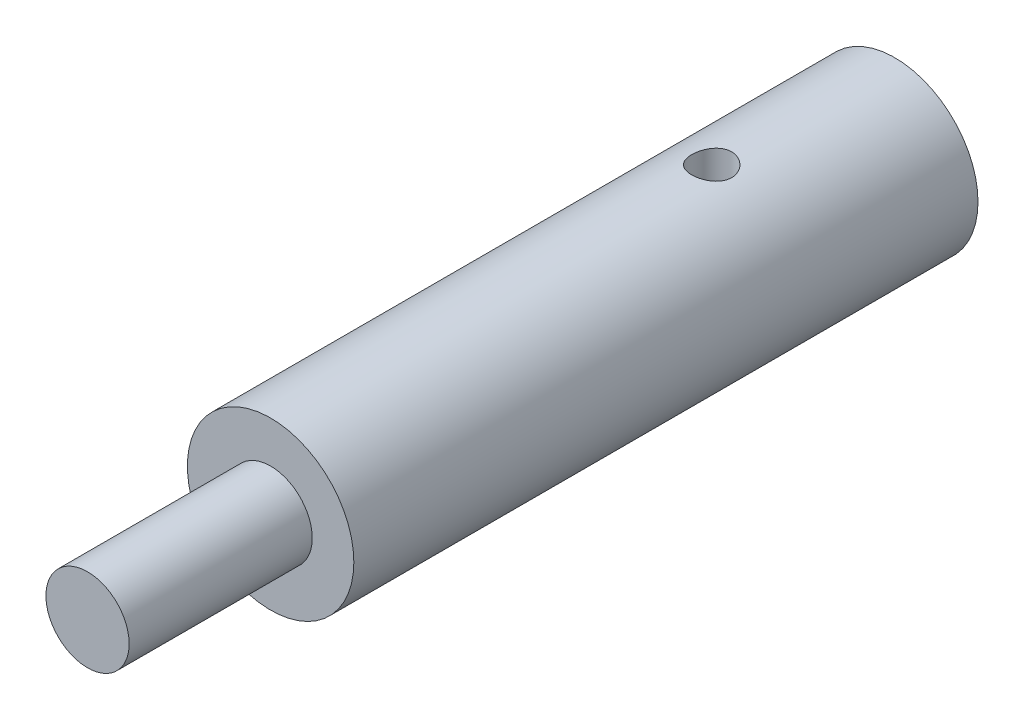
ISO-10303-21;
HEADER;
FILE_DESCRIPTION(('STEP AP214'),'2;1');
FILE_NAME('part.step','',(''),(''),'','','');
FILE_SCHEMA(('AUTOMOTIVE_DESIGN { 1 0 10303 214 1 1 1 1 }'));
ENDSEC;
DATA;
#1=APPLICATION_CONTEXT('core data for automotive mechanical design processes');
#2=APPLICATION_PROTOCOL_DEFINITION('international standard','automotive_design',2000,#1);
#3=PRODUCT_CONTEXT('',#1,'mechanical');
#4=PRODUCT('Part','Part','',(#3));
#5=PRODUCT_RELATED_PRODUCT_CATEGORY('part','',(#4));
#6=PRODUCT_DEFINITION_FORMATION('','',#4);
#7=PRODUCT_DEFINITION_CONTEXT('part definition',#1,'design');
#8=PRODUCT_DEFINITION('design','',#6,#7);
#9=PRODUCT_DEFINITION_SHAPE('','',#8);
#10=(LENGTH_UNIT() NAMED_UNIT(*) SI_UNIT(.MILLI.,.METRE.));
#11=(NAMED_UNIT(*) PLANE_ANGLE_UNIT() SI_UNIT($,.RADIAN.));
#12=(NAMED_UNIT(*) SI_UNIT($,.STERADIAN.) SOLID_ANGLE_UNIT());
#13=UNCERTAINTY_MEASURE_WITH_UNIT(LENGTH_MEASURE(1.E-05),#10,'distance_accuracy_value','');
#14=(GEOMETRIC_REPRESENTATION_CONTEXT(3) GLOBAL_UNCERTAINTY_ASSIGNED_CONTEXT((#13)) GLOBAL_UNIT_ASSIGNED_CONTEXT((#10,
#11,#12)) REPRESENTATION_CONTEXT('',''));
#15=CARTESIAN_POINT('',(0.,0.,0.));
#16=DIRECTION('',(0.,0.,1.));
#17=DIRECTION('',(1.,0.,0.));
#18=AXIS2_PLACEMENT_3D('',#15,#16,#17);
#19=CARTESIAN_POINT('',(0.,5.,0.));
#20=DIRECTION('',(0.,0.,-1.));
#21=DIRECTION('',(-1.,0.,0.));
#22=AXIS2_PLACEMENT_3D('',#19,#20,#21);
#23=PLANE('',#22);
#24=CARTESIAN_POINT('',(0.,0.,0.));
#25=DIRECTION('',(0.,0.,1.));
#26=DIRECTION('',(1.,0.,0.));
#27=AXIS2_PLACEMENT_3D('',#24,#25,#26);
#28=CIRCLE('',#27,5.);
#29=CARTESIAN_POINT('',(5.,0.,0.));
#30=VERTEX_POINT('',#29);
#31=EDGE_CURVE('E83',#30,#30,#28,.T.);
#32=ORIENTED_EDGE('',*,*,#31,.T.);
#33=EDGE_LOOP('',(#32));
#34=FACE_BOUND('',#33,.T.);
#35=ADVANCED_FACE('F31',(#34),#23,.F.);
#36=CARTESIAN_POINT('',(0.,0.,-97.));
#37=DIRECTION('',(0.,0.,1.));
#38=DIRECTION('',(1.,0.,0.));
#39=AXIS2_PLACEMENT_3D('',#36,#37,#38);
#40=PLANE('',#39);
#41=CARTESIAN_POINT('',(0.,0.,-97.));
#42=DIRECTION('',(0.,0.,1.));
#43=DIRECTION('',(1.,0.,0.));
#44=AXIS2_PLACEMENT_3D('',#41,#42,#43);
#45=CIRCLE('',#44,10.);
#46=CARTESIAN_POINT('',(10.,0.,-97.));
#47=VERTEX_POINT('',#46);
#48=EDGE_CURVE('E45',#47,#47,#45,.T.);
#49=ORIENTED_EDGE('',*,*,#48,.F.);
#50=EDGE_LOOP('',(#49));
#51=FACE_BOUND('',#50,.T.);
#52=ADVANCED_FACE('F72',(#51),#40,.F.);
#53=CARTESIAN_POINT('',(0.,0.,0.));
#54=DIRECTION('',(0.,0.,1.));
#55=DIRECTION('',(1.,0.,0.));
#56=AXIS2_PLACEMENT_3D('',#53,#54,#55);
#57=CYLINDRICAL_SURFACE('',#56,9.99999999999999);
#58=CARTESIAN_POINT('',(0.,-9.99999999999999,-72.6));
#59=CARTESIAN_POINT('',(0.132771143222972,-9.99999765719742,-72.6000040192618));
#60=CARTESIAN_POINT('',(0.265588336742452,-9.99732925078871,-72.6110547281888));
#61=CARTESIAN_POINT('',(0.527427432777102,-9.9869427157546,-72.6549061916763));
#62=CARTESIAN_POINT('',(0.656446946571418,-9.97922147697325,-72.6877203423957));
#63=CARTESIAN_POINT('',(0.90687071577121,-9.9595858566556,-72.7739938676035));
#64=CARTESIAN_POINT('',(1.02828353859857,-9.94767629622729,-72.8274295118861));
#65=CARTESIAN_POINT('',(1.2604201430381,-9.92093803540106,-72.9533483491567));
#66=CARTESIAN_POINT('',(1.37114377180133,-9.90610929326983,-73.0258318144618));
#67=CARTESIAN_POINT('',(1.58087410715178,-9.87483088118277,-73.1892513427004));
#68=CARTESIAN_POINT('',(1.67964761680384,-9.85835779634484,-73.2804822248394));
#69=CARTESIAN_POINT('',(1.86064864649554,-9.82580594961176,-73.4781750952517));
#70=CARTESIAN_POINT('',(1.94287443699591,-9.80972722908895,-73.5846386736328));
#71=CARTESIAN_POINT('',(2.08951994844012,-9.77955037524956,-73.8115566664139));
#72=CARTESIAN_POINT('',(2.15368301638052,-9.76548206522498,-73.9321812670071));
#73=CARTESIAN_POINT('',(2.26073266357866,-9.74125867299582,-74.1828958681028));
#74=CARTESIAN_POINT('',(2.30362235335651,-9.7311030187447,-74.3129844816185));
#75=CARTESIAN_POINT('',(2.3661204648693,-9.71609477400058,-74.5763812586151));
#76=CARTESIAN_POINT('',(2.38614609920493,-9.71114728274744,-74.7095848972204));
#77=CARTESIAN_POINT('',(2.40364647103269,-9.70683116847563,-74.9775459037142));
#78=CARTESIAN_POINT('',(2.40112457345919,-9.70746171300544,-75.1123030367655));
#79=CARTESIAN_POINT('',(2.37393529665554,-9.7141449109606,-75.3763807728103));
#80=CARTESIAN_POINT('',(2.34976082720396,-9.72007687370338,-75.5057556521516));
#81=CARTESIAN_POINT('',(2.28073713309751,-9.73650269910282,-75.7585578533183));
#82=CARTESIAN_POINT('',(2.23588653897622,-9.74699686393063,-75.8819847805875));
#83=CARTESIAN_POINT('',(2.12635296985426,-9.77147813875558,-76.1207303824675));
#84=CARTESIAN_POINT('',(2.06148758597569,-9.78549714606063,-76.2359619623333));
#85=CARTESIAN_POINT('',(1.91389351165106,-9.81543000369571,-76.454083600578));
#86=CARTESIAN_POINT('',(1.83116192274118,-9.83134416129098,-76.5569716522281));
#87=CARTESIAN_POINT('',(1.64761195127077,-9.8637856205912,-76.750314856255));
#88=CARTESIAN_POINT('',(1.54637651511927,-9.8803180630411,-76.8403736792498));
#89=CARTESIAN_POINT('',(1.33004473967753,-9.91175612759433,-77.0023077757971));
#90=CARTESIAN_POINT('',(1.21494803985713,-9.92666170736388,-77.0741825762341));
#91=CARTESIAN_POINT('',(0.973622781748649,-9.95323159655372,-77.1978377764902));
#92=CARTESIAN_POINT('',(0.847362229568439,-9.96488616464153,-77.2495579649902));
#93=CARTESIAN_POINT('',(0.587598084862946,-9.98356963793232,-77.3309320632389));
#94=CARTESIAN_POINT('',(0.454095770710135,-9.99059935669204,-77.3605898541014));
#95=CARTESIAN_POINT('',(0.187029919721337,-9.99912220341669,-77.3964016517216));
#96=CARTESIAN_POINT('',(0.0535427844360104,-10.0007425704603,-77.4030959139693));
#97=CARTESIAN_POINT('',(-0.212643505269299,-9.99862459355786,-77.3942665865193));
#98=CARTESIAN_POINT('',(-0.345342723811956,-9.99488669185398,-77.3787448304102));
#99=CARTESIAN_POINT('',(-0.604338064087074,-9.98255331161744,-77.3263704171869));
#100=CARTESIAN_POINT('',(-0.730696463449043,-9.97402412722935,-77.2898087123409));
#101=CARTESIAN_POINT('',(-0.975482640107798,-9.95306680125279,-77.1967214466438));
#102=CARTESIAN_POINT('',(-1.09390965331317,-9.94063828466544,-77.1401939656176));
#103=CARTESIAN_POINT('',(-1.32164920796458,-9.9129528119678,-77.0077067251217));
#104=CARTESIAN_POINT('',(-1.43077741392292,-9.89765225424743,-76.9314394264602));
#105=CARTESIAN_POINT('',(-1.63487923277297,-9.86599491255418,-76.7620344567896));
#106=CARTESIAN_POINT('',(-1.72985060059437,-9.84963796164085,-76.6688941151364));
#107=CARTESIAN_POINT('',(-1.90513963031985,-9.81725937143993,-76.4658873350321));
#108=CARTESIAN_POINT('',(-1.98507979238018,-9.80125354108243,-76.3556919023304));
#109=CARTESIAN_POINT('',(-2.12532816659143,-9.77180310372723,-76.1231276576865));
#110=CARTESIAN_POINT('',(-2.18563725778222,-9.75835838205941,-76.0007593911398));
#111=CARTESIAN_POINT('',(-2.28447194814786,-9.73569516180324,-75.7479899891556));
#112=CARTESIAN_POINT('',(-2.32312603510095,-9.72645179800209,-75.6176414372201));
#113=CARTESIAN_POINT('',(-2.37790704228604,-9.71320581404568,-75.3520430519376));
#114=CARTESIAN_POINT('',(-2.39403843420351,-9.70920215360273,-75.2167941969756));
#115=CARTESIAN_POINT('',(-2.40309653159154,-9.70696369740483,-74.9490634397842));
#116=CARTESIAN_POINT('',(-2.39662485273724,-9.70857933064217,-74.816602802941));
#117=CARTESIAN_POINT('',(-2.36202676501102,-9.71705411689969,-74.5547201886187));
#118=CARTESIAN_POINT('',(-2.33390072720101,-9.72391318007019,-74.4252981591103));
#119=CARTESIAN_POINT('',(-2.25710873042806,-9.74202199812233,-74.173761957962));
#120=CARTESIAN_POINT('',(-2.20854721636483,-9.75324940487049,-74.0516141819332));
#121=CARTESIAN_POINT('',(-2.09234698864472,-9.77883468901956,-73.8171164688929));
#122=CARTESIAN_POINT('',(-2.02470583947885,-9.79319296602185,-73.7047677851309));
#123=CARTESIAN_POINT('',(-1.87034406166769,-9.82385546042193,-73.4901303999044));
#124=CARTESIAN_POINT('',(-1.78320214383213,-9.84019829580225,-73.388150141521));
#125=CARTESIAN_POINT('',(-1.59314459818589,-9.87274878649193,-73.2000640095584));
#126=CARTESIAN_POINT('',(-1.49022527099387,-9.88895640915531,-73.1139618694318));
#127=CARTESIAN_POINT('',(-1.26950639904112,-9.9197256239664,-72.9587125923562));
#128=CARTESIAN_POINT('',(-1.15149131487522,-9.9342560160975,-72.8898652756464));
#129=CARTESIAN_POINT('',(-0.905228982628549,-9.95971044884656,-72.7730963738017));
#130=CARTESIAN_POINT('',(-0.776989578952988,-9.97063722182837,-72.7251589252867));
#131=CARTESIAN_POINT('',(-0.540709620555822,-9.98592479211974,-72.6591690998898));
#132=CARTESIAN_POINT('',(-0.433849653014745,-9.99116795596635,-72.6370267073714));
#133=CARTESIAN_POINT('',(-0.218003381982604,-9.99820641196198,-72.6074409753185));
#134=CARTESIAN_POINT('',(-0.109017214332624,-10.0000019236545,-72.5999966998196));
#135=CARTESIAN_POINT('',(0.,-9.99999999999999,-72.6));
#136=B_SPLINE_CURVE_WITH_KNOTS('',3,(#58,#59,#60,#61,#62,#63,#64,#65,#66,#67,#68,#69,#70,#71,
#72,#73,#74,#75,#76,#77,#78,#79,#80,#81,#82,#83,#84,#85,#86,#87,#88,#89,#90,#91,#92,#93,#94,#95,
#96,#97,#98,#99,#100,#101,#102,#103,#104,#105,#106,#107,#108,#109,#110,#111,#112,#113,#114,#115,
#116,#117,#118,#119,#120,#121,#122,#123,#124,#125,#126,#127,#128,#129,#130,#131,#132,#133,#134,
#135),.UNSPECIFIED.,.T.,.F.,(4,2,2,2,2,2,2,2,2,2,2,2,2,2,2,2,2,2,2,2,2,2,2,2,2,2,2,2,2,2,2,2,2,
2,2,2,2,2,4),(0.,0.39791407949334,0.796073316607057,1.19377573126801,1.59148383198815,
1.99600456118686,2.40056754826645,2.81061809640678,3.22060867068029,3.6229919628729,
4.02531520544371,4.4187061997187,4.81212325367308,5.20923734016936,5.60641589960001,
6.01399966705547,6.42159403801736,6.83039691742562,7.23912786512331,7.6381742144866,
8.03718763064773,8.43081149895846,8.82447323369685,9.22468186510353,9.62495389645843,
10.0342259618554,10.4434796983502,10.8502787295105,11.2569969827661,11.6529732363408,
12.0489427047486,12.4429125080674,12.836932624275,13.2404675687991,13.6440972766262,
14.0543179364728,14.4642268366901,14.7909713842839,15.1176951243759),.UNSPECIFIED.);
#137=CARTESIAN_POINT('',(0.,-9.99999999999999,-72.6));
#138=VERTEX_POINT('',#137);
#139=EDGE_CURVE('E10',#138,#138,#136,.T.);
#140=ORIENTED_EDGE('',*,*,#139,.T.);
#141=EDGE_LOOP('',(#140));
#142=FACE_BOUND('',#141,.T.);
#143=CARTESIAN_POINT('',(0.,10.,-72.6));
#144=CARTESIAN_POINT('',(-0.132771143222972,9.99999765719742,-72.6000040192618));
#145=CARTESIAN_POINT('',(-0.265588336742452,9.99732925078871,-72.6110547281888));
#146=CARTESIAN_POINT('',(-0.527427432777102,9.98694271575459,-72.6549061916763));
#147=CARTESIAN_POINT('',(-0.656446946571418,9.97922147697325,-72.6877203423957));
#148=CARTESIAN_POINT('',(-0.90687071577121,9.9595858566556,-72.7739938676035));
#149=CARTESIAN_POINT('',(-1.02828353859857,9.94767629622729,-72.8274295118861));
#150=CARTESIAN_POINT('',(-1.2604201430381,9.92093803540106,-72.9533483491567));
#151=CARTESIAN_POINT('',(-1.37114377180133,9.90610929326983,-73.0258318144618));
#152=CARTESIAN_POINT('',(-1.58087410715177,9.87483088118277,-73.1892513427004));
#153=CARTESIAN_POINT('',(-1.67964761680383,9.85835779634484,-73.2804822248394));
#154=CARTESIAN_POINT('',(-1.86064864649553,9.82580594961176,-73.4781750952517));
#155=CARTESIAN_POINT('',(-1.94287443699591,9.80972722908895,-73.5846386736328));
#156=CARTESIAN_POINT('',(-2.08951994844011,9.77955037524957,-73.8115566664139));
#157=CARTESIAN_POINT('',(-2.15368301638051,9.76548206522498,-73.9321812670071));
#158=CARTESIAN_POINT('',(-2.26073266357865,9.74125867299582,-74.1828958681028));
#159=CARTESIAN_POINT('',(-2.30362235335651,9.7311030187447,-74.3129844816185));
#160=CARTESIAN_POINT('',(-2.3661204648693,9.71609477400059,-74.5763812586151));
#161=CARTESIAN_POINT('',(-2.38614609920493,9.71114728274744,-74.7095848972204));
#162=CARTESIAN_POINT('',(-2.40364647103269,9.70683116847563,-74.9775459037142));
#163=CARTESIAN_POINT('',(-2.40112457345919,9.70746171300544,-75.1123030367655));
#164=CARTESIAN_POINT('',(-2.37393529665554,9.7141449109606,-75.3763807728103));
#165=CARTESIAN_POINT('',(-2.34976082720396,9.72007687370338,-75.5057556521516));
#166=CARTESIAN_POINT('',(-2.28073713309751,9.73650269910282,-75.7585578533183));
#167=CARTESIAN_POINT('',(-2.23588653897622,9.74699686393063,-75.8819847805875));
#168=CARTESIAN_POINT('',(-2.12635296985426,9.77147813875558,-76.1207303824675));
#169=CARTESIAN_POINT('',(-2.06148758597569,9.78549714606063,-76.2359619623333));
#170=CARTESIAN_POINT('',(-1.91389351165106,9.81543000369571,-76.454083600578));
#171=CARTESIAN_POINT('',(-1.83116192274118,9.83134416129098,-76.5569716522281));
#172=CARTESIAN_POINT('',(-1.64761195127077,9.8637856205912,-76.750314856255));
#173=CARTESIAN_POINT('',(-1.54637651511927,9.8803180630411,-76.8403736792498));
#174=CARTESIAN_POINT('',(-1.33004473967753,9.91175612759433,-77.0023077757971));
#175=CARTESIAN_POINT('',(-1.21494803985713,9.92666170736388,-77.0741825762341));
#176=CARTESIAN_POINT('',(-0.973622781748649,9.95323159655372,-77.1978377764902));
#177=CARTESIAN_POINT('',(-0.847362229568439,9.96488616464153,-77.2495579649902));
#178=CARTESIAN_POINT('',(-0.587598084862946,9.98356963793232,-77.3309320632389));
#179=CARTESIAN_POINT('',(-0.454095770710135,9.99059935669204,-77.3605898541014));
#180=CARTESIAN_POINT('',(-0.187029919721337,9.99912220341669,-77.3964016517216));
#181=CARTESIAN_POINT('',(-0.0535427844360104,10.0007425704603,-77.4030959139693));
#182=CARTESIAN_POINT('',(0.212643505269299,9.99862459355786,-77.3942665865193));
#183=CARTESIAN_POINT('',(0.345342723811956,9.99488669185398,-77.3787448304102));
#184=CARTESIAN_POINT('',(0.604338064087074,9.98255331161744,-77.3263704171869));
#185=CARTESIAN_POINT('',(0.730696463449043,9.97402412722935,-77.2898087123409));
#186=CARTESIAN_POINT('',(0.975482640107798,9.95306680125279,-77.1967214466438));
#187=CARTESIAN_POINT('',(1.09390965331317,9.94063828466544,-77.1401939656176));
#188=CARTESIAN_POINT('',(1.32164920796458,9.9129528119678,-77.0077067251217));
#189=CARTESIAN_POINT('',(1.43077741392292,9.89765225424743,-76.9314394264602));
#190=CARTESIAN_POINT('',(1.63487923277297,9.86599491255418,-76.7620344567896));
#191=CARTESIAN_POINT('',(1.72985060059437,9.84963796164085,-76.6688941151364));
#192=CARTESIAN_POINT('',(1.90513963031985,9.81725937143993,-76.4658873350321));
#193=CARTESIAN_POINT('',(1.98507979238018,9.80125354108243,-76.3556919023304));
#194=CARTESIAN_POINT('',(2.12532816659143,9.77180310372723,-76.1231276576865));
#195=CARTESIAN_POINT('',(2.18563725778222,9.75835838205941,-76.0007593911398));
#196=CARTESIAN_POINT('',(2.28447194814786,9.73569516180324,-75.7479899891556));
#197=CARTESIAN_POINT('',(2.32312603510095,9.72645179800209,-75.6176414372201));
#198=CARTESIAN_POINT('',(2.37790704228604,9.71320581404568,-75.3520430519376));
#199=CARTESIAN_POINT('',(2.39403843420351,9.70920215360273,-75.2167941969756));
#200=CARTESIAN_POINT('',(2.40309653159154,9.70696369740483,-74.9490634397842));
#201=CARTESIAN_POINT('',(2.39662485273724,9.70857933064217,-74.816602802941));
#202=CARTESIAN_POINT('',(2.36202676501102,9.71705411689969,-74.5547201886187));
#203=CARTESIAN_POINT('',(2.33390072720101,9.72391318007019,-74.4252981591103));
#204=CARTESIAN_POINT('',(2.25710873042806,9.74202199812233,-74.173761957962));
#205=CARTESIAN_POINT('',(2.20854721636483,9.75324940487049,-74.0516141819332));
#206=CARTESIAN_POINT('',(2.09234698864472,9.77883468901956,-73.8171164688929));
#207=CARTESIAN_POINT('',(2.02470583947885,9.79319296602185,-73.7047677851309));
#208=CARTESIAN_POINT('',(1.87034406166769,9.82385546042193,-73.4901303999044));
#209=CARTESIAN_POINT('',(1.78320214383213,9.84019829580225,-73.388150141521));
#210=CARTESIAN_POINT('',(1.59314459818589,9.87274878649193,-73.2000640095584));
#211=CARTESIAN_POINT('',(1.49022527099387,9.88895640915531,-73.1139618694318));
#212=CARTESIAN_POINT('',(1.26950639904112,9.9197256239664,-72.9587125923562));
#213=CARTESIAN_POINT('',(1.15149131487522,9.9342560160975,-72.8898652756464));
#214=CARTESIAN_POINT('',(0.905228982628549,9.95971044884655,-72.7730963738017));
#215=CARTESIAN_POINT('',(0.776989578952988,9.97063722182837,-72.7251589252867));
#216=CARTESIAN_POINT('',(0.540709620555822,9.98592479211974,-72.6591690998898));
#217=CARTESIAN_POINT('',(0.433849653014745,9.99116795596635,-72.6370267073714));
#218=CARTESIAN_POINT('',(0.218003381982604,9.99820641196198,-72.6074409753185));
#219=CARTESIAN_POINT('',(0.109017214332624,10.0000019236545,-72.5999966998196));
#220=CARTESIAN_POINT('',(0.,10.,-72.6));
#221=B_SPLINE_CURVE_WITH_KNOTS('',3,(#143,#144,#145,#146,#147,#148,#149,#150,#151,#152,#153,
#154,#155,#156,#157,#158,#159,#160,#161,#162,#163,#164,#165,#166,#167,#168,#169,#170,#171,#172,
#173,#174,#175,#176,#177,#178,#179,#180,#181,#182,#183,#184,#185,#186,#187,#188,#189,#190,#191,
#192,#193,#194,#195,#196,#197,#198,#199,#200,#201,#202,#203,#204,#205,#206,#207,#208,#209,#210,
#211,#212,#213,#214,#215,#216,#217,#218,#219,#220),.UNSPECIFIED.,.T.,.F.,(4,2,2,2,2,2,2,2,2,2,2,
2,2,2,2,2,2,2,2,2,2,2,2,2,2,2,2,2,2,2,2,2,2,2,2,2,2,2,4),(0.,0.39791407949334,0.796073316607057,
1.19377573126801,1.59148383198815,1.99600456118683,2.40056754826645,2.81061809640676,
3.22060867068029,3.62299196287287,4.02531520544371,4.4187061997187,4.81212325367308,
5.20923734016936,5.60641589960001,6.01399966705547,6.42159403801736,6.83039691742562,
7.23912786512331,7.6381742144866,8.03718763064773,8.43081149895846,8.82447323369686,
9.22468186510353,9.62495389645843,10.0342259618554,10.4434796983502,10.8502787295105,
11.2569969827661,11.6529732363408,12.0489427047486,12.4429125080674,12.836932624275,
13.2404675687991,13.6440972766262,14.0543179364728,14.4642268366901,14.7909713842839,
15.1176951243759),.UNSPECIFIED.);
#222=CARTESIAN_POINT('',(0.,10.,-72.6));
#223=VERTEX_POINT('',#222);
#224=EDGE_CURVE('E41',#223,#223,#221,.T.);
#225=ORIENTED_EDGE('',*,*,#224,.T.);
#226=EDGE_LOOP('',(#225));
#227=FACE_BOUND('',#226,.T.);
#228=CARTESIAN_POINT('',(0.,0.,-22.));
#229=DIRECTION('',(0.,0.,1.));
#230=DIRECTION('',(1.,0.,0.));
#231=AXIS2_PLACEMENT_3D('',#228,#229,#230);
#232=CIRCLE('',#231,9.99999999999999);
#233=CARTESIAN_POINT('',(9.99999999999999,0.,-22.));
#234=VERTEX_POINT('',#233);
#235=EDGE_CURVE('E49',#234,#234,#232,.T.);
#236=ORIENTED_EDGE('',*,*,#235,.F.);
#237=EDGE_LOOP('',(#236));
#238=FACE_BOUND('',#237,.T.);
#239=ORIENTED_EDGE('',*,*,#48,.T.);
#240=EDGE_LOOP('',(#239));
#241=FACE_BOUND('',#240,.T.);
#242=ADVANCED_FACE('F54',(#142,#227,#238,#241),#57,.T.);
#243=CARTESIAN_POINT('',(0.,9.99999999999999,-22.));
#244=DIRECTION('',(0.,0.,-1.));
#245=DIRECTION('',(-1.,0.,0.));
#246=AXIS2_PLACEMENT_3D('',#243,#244,#245);
#247=PLANE('',#246);
#248=CARTESIAN_POINT('',(0.,0.,-22.));
#249=DIRECTION('',(0.,0.,1.));
#250=DIRECTION('',(1.,0.,0.));
#251=AXIS2_PLACEMENT_3D('',#248,#249,#250);
#252=CIRCLE('',#251,5.);
#253=CARTESIAN_POINT('',(5.,0.,-22.));
#254=VERTEX_POINT('',#253);
#255=EDGE_CURVE('E84',#254,#254,#252,.T.);
#256=ORIENTED_EDGE('',*,*,#255,.F.);
#257=EDGE_LOOP('',(#256));
#258=FACE_BOUND('',#257,.T.);
#259=ORIENTED_EDGE('',*,*,#235,.T.);
#260=EDGE_LOOP('',(#259));
#261=FACE_BOUND('',#260,.T.);
#262=ADVANCED_FACE('F65',(#258,#261),#247,.F.);
#263=CARTESIAN_POINT('',(0.,0.,0.));
#264=DIRECTION('',(0.,0.,1.));
#265=DIRECTION('',(1.,0.,0.));
#266=AXIS2_PLACEMENT_3D('',#263,#264,#265);
#267=CYLINDRICAL_SURFACE('',#266,5.);
#268=ORIENTED_EDGE('',*,*,#31,.F.);
#269=EDGE_LOOP('',(#268));
#270=FACE_BOUND('',#269,.T.);
#271=ORIENTED_EDGE('',*,*,#255,.T.);
#272=EDGE_LOOP('',(#271));
#273=FACE_BOUND('',#272,.T.);
#274=ADVANCED_FACE('F61',(#270,#273),#267,.T.);
#275=CARTESIAN_POINT('',(0.,-10.,-75.));
#276=DIRECTION('',(0.,1.,0.));
#277=DIRECTION('',(0.,0.,1.));
#278=AXIS2_PLACEMENT_3D('',#275,#276,#277);
#279=CYLINDRICAL_SURFACE('',#278,2.4);
#280=ORIENTED_EDGE('',*,*,#224,.F.);
#281=EDGE_LOOP('',(#280));
#282=FACE_BOUND('',#281,.T.);
#283=ORIENTED_EDGE('',*,*,#139,.F.);
#284=EDGE_LOOP('',(#283));
#285=FACE_BOUND('',#284,.T.);
#286=ADVANCED_FACE('F57',(#282,#285),#279,.F.);
#287=CLOSED_SHELL('',(#35,#52,#242,#262,#274,#286));
#288=MANIFOLD_SOLID_BREP('B2',#287);
#289=ADVANCED_BREP_SHAPE_REPRESENTATION('',(#18,#288),#14);
#290=SHAPE_DEFINITION_REPRESENTATION(#9,#289);
ENDSEC;
END-ISO-10303-21;
